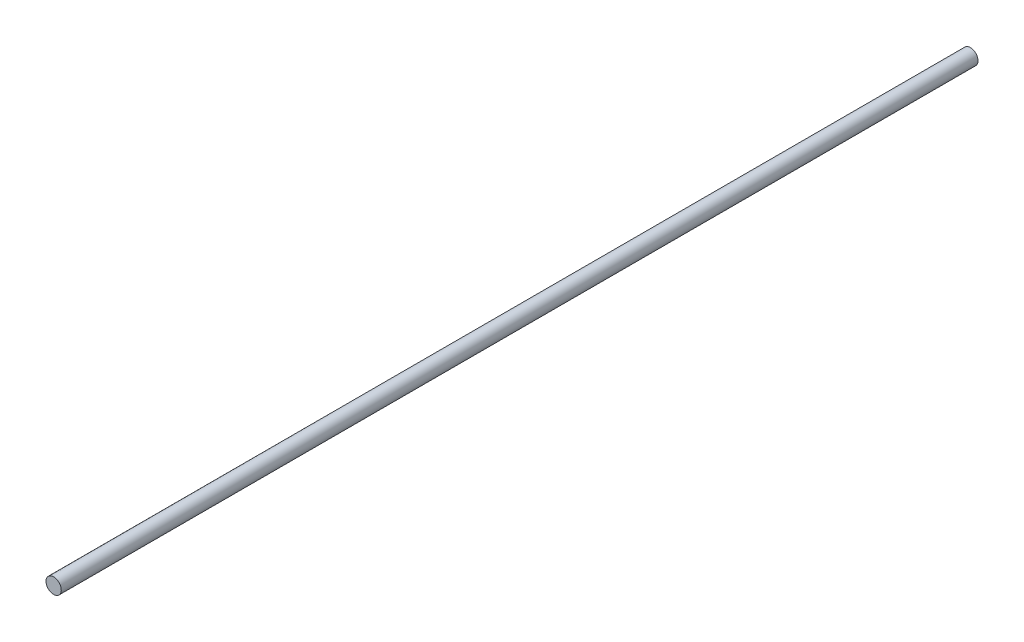
ISO-10303-21;
HEADER;
FILE_DESCRIPTION(('STEP AP214'),'2;1');
FILE_NAME('part.step','',(''),(''),'','','');
FILE_SCHEMA(('AUTOMOTIVE_DESIGN { 1 0 10303 214 1 1 1 1 }'));
ENDSEC;
DATA;
#1=APPLICATION_CONTEXT('core data for automotive mechanical design processes');
#2=APPLICATION_PROTOCOL_DEFINITION('international standard','automotive_design',2000,#1);
#3=PRODUCT_CONTEXT('',#1,'mechanical');
#4=PRODUCT('Part','Part','',(#3));
#5=PRODUCT_RELATED_PRODUCT_CATEGORY('part','',(#4));
#6=PRODUCT_DEFINITION_FORMATION('','',#4);
#7=PRODUCT_DEFINITION_CONTEXT('part definition',#1,'design');
#8=PRODUCT_DEFINITION('design','',#6,#7);
#9=PRODUCT_DEFINITION_SHAPE('','',#8);
#10=(LENGTH_UNIT() NAMED_UNIT(*) SI_UNIT(.MILLI.,.METRE.));
#11=(NAMED_UNIT(*) PLANE_ANGLE_UNIT() SI_UNIT($,.RADIAN.));
#12=(NAMED_UNIT(*) SI_UNIT($,.STERADIAN.) SOLID_ANGLE_UNIT());
#13=UNCERTAINTY_MEASURE_WITH_UNIT(LENGTH_MEASURE(1.E-05),#10,'distance_accuracy_value','');
#14=(GEOMETRIC_REPRESENTATION_CONTEXT(3) GLOBAL_UNCERTAINTY_ASSIGNED_CONTEXT((#13)) GLOBAL_UNIT_ASSIGNED_CONTEXT((#10,
#11,#12)) REPRESENTATION_CONTEXT('',''));
#15=CARTESIAN_POINT('',(0.,0.,0.));
#16=DIRECTION('',(0.,0.,1.));
#17=DIRECTION('',(1.,0.,0.));
#18=AXIS2_PLACEMENT_3D('',#15,#16,#17);
#19=CARTESIAN_POINT('',(0.,0.,600.));
#20=DIRECTION('',(0.,0.,-1.));
#21=DIRECTION('',(-1.,0.,0.));
#22=AXIS2_PLACEMENT_3D('',#19,#20,#21);
#23=CYLINDRICAL_SURFACE('',#22,5.);
#24=CARTESIAN_POINT('',(0.,0.,600.));
#25=DIRECTION('',(0.,0.,1.));
#26=DIRECTION('',(1.,0.,0.));
#27=AXIS2_PLACEMENT_3D('',#24,#25,#26);
#28=CIRCLE('',#27,5.);
#29=CARTESIAN_POINT('',(5.,0.,600.));
#30=VERTEX_POINT('',#29);
#31=EDGE_CURVE('E10',#30,#30,#28,.T.);
#32=ORIENTED_EDGE('',*,*,#31,.F.);
#33=EDGE_LOOP('',(#32));
#34=FACE_BOUND('',#33,.T.);
#35=CARTESIAN_POINT('',(0.,0.,0.));
#36=DIRECTION('',(0.,0.,1.));
#37=DIRECTION('',(1.,0.,0.));
#38=AXIS2_PLACEMENT_3D('',#35,#36,#37);
#39=CIRCLE('',#38,5.);
#40=CARTESIAN_POINT('',(5.,0.,0.));
#41=VERTEX_POINT('',#40);
#42=EDGE_CURVE('E40',#41,#41,#39,.T.);
#43=ORIENTED_EDGE('',*,*,#42,.T.);
#44=EDGE_LOOP('',(#43));
#45=FACE_BOUND('',#44,.T.);
#46=ADVANCED_FACE('F37',(#34,#45),#23,.T.);
#47=CARTESIAN_POINT('',(0.,0.,600.));
#48=DIRECTION('',(0.,0.,1.));
#49=DIRECTION('',(1.,0.,0.));
#50=AXIS2_PLACEMENT_3D('',#47,#48,#49);
#51=PLANE('',#50);
#52=ORIENTED_EDGE('',*,*,#31,.T.);
#53=EDGE_LOOP('',(#52));
#54=FACE_BOUND('',#53,.T.);
#55=ADVANCED_FACE('F54',(#54),#51,.T.);
#56=CARTESIAN_POINT('',(0.,0.,0.));
#57=DIRECTION('',(0.,0.,1.));
#58=DIRECTION('',(1.,0.,0.));
#59=AXIS2_PLACEMENT_3D('',#56,#57,#58);
#60=PLANE('',#59);
#61=ORIENTED_EDGE('',*,*,#42,.F.);
#62=EDGE_LOOP('',(#61));
#63=FACE_BOUND('',#62,.T.);
#64=ADVANCED_FACE('F52',(#63),#60,.F.);
#65=CLOSED_SHELL('',(#46,#55,#64));
#66=MANIFOLD_SOLID_BREP('B2',#65);
#67=ADVANCED_BREP_SHAPE_REPRESENTATION('',(#18,#66),#14);
#68=SHAPE_DEFINITION_REPRESENTATION(#9,#67);
ENDSEC;
END-ISO-10303-21;
